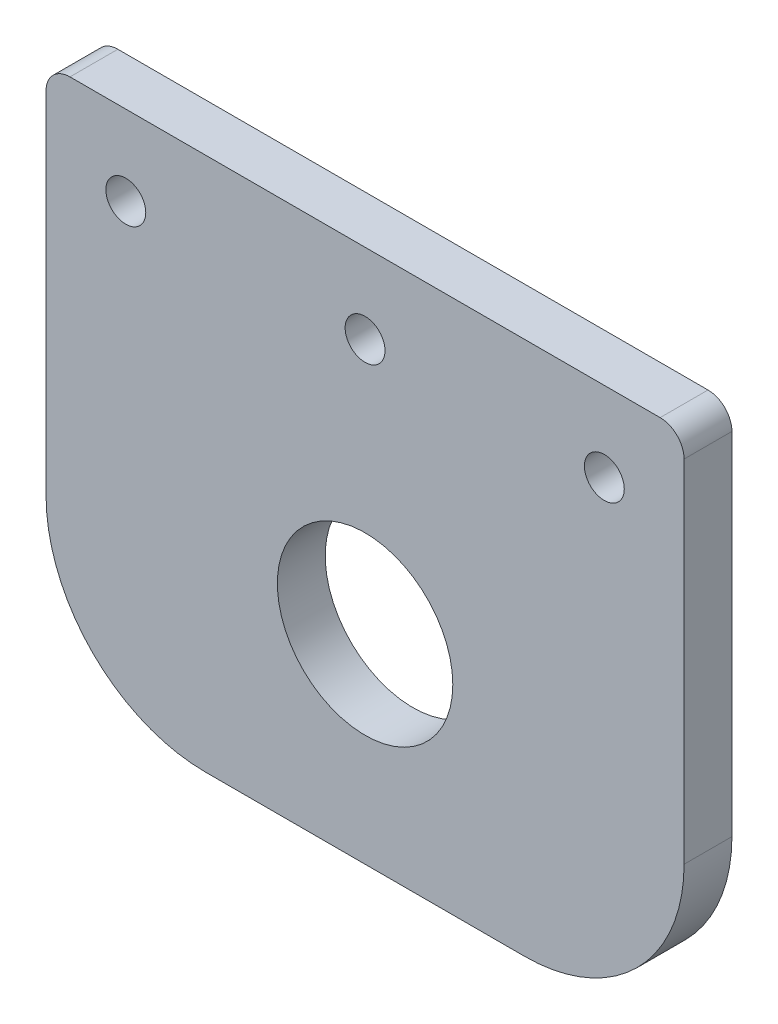
ISO-10303-21;
HEADER;
FILE_DESCRIPTION(('STEP AP214'),'2;1');
FILE_NAME('part.step','',(''),(''),'','','');
FILE_SCHEMA(('AUTOMOTIVE_DESIGN { 1 0 10303 214 1 1 1 1 }'));
ENDSEC;
DATA;
#1=APPLICATION_CONTEXT('core data for automotive mechanical design processes');
#2=APPLICATION_PROTOCOL_DEFINITION('international standard','automotive_design',2000,#1);
#3=PRODUCT_CONTEXT('',#1,'mechanical');
#4=PRODUCT('Part','Part','',(#3));
#5=PRODUCT_RELATED_PRODUCT_CATEGORY('part','',(#4));
#6=PRODUCT_DEFINITION_FORMATION('','',#4);
#7=PRODUCT_DEFINITION_CONTEXT('part definition',#1,'design');
#8=PRODUCT_DEFINITION('design','',#6,#7);
#9=PRODUCT_DEFINITION_SHAPE('','',#8);
#10=(LENGTH_UNIT() NAMED_UNIT(*) SI_UNIT(.MILLI.,.METRE.));
#11=(NAMED_UNIT(*) PLANE_ANGLE_UNIT() SI_UNIT($,.RADIAN.));
#12=(NAMED_UNIT(*) SI_UNIT($,.STERADIAN.) SOLID_ANGLE_UNIT());
#13=UNCERTAINTY_MEASURE_WITH_UNIT(LENGTH_MEASURE(1.E-05),#10,'distance_accuracy_value','');
#14=(GEOMETRIC_REPRESENTATION_CONTEXT(3) GLOBAL_UNCERTAINTY_ASSIGNED_CONTEXT((#13)) GLOBAL_UNIT_ASSIGNED_CONTEXT((#10,
#11,#12)) REPRESENTATION_CONTEXT('',''));
#15=CARTESIAN_POINT('',(0.,0.,0.));
#16=DIRECTION('',(0.,0.,1.));
#17=DIRECTION('',(1.,0.,0.));
#18=AXIS2_PLACEMENT_3D('',#15,#16,#17);
#19=CARTESIAN_POINT('',(0.,0.,6.));
#20=DIRECTION('',(0.,0.,1.));
#21=DIRECTION('',(1.,0.,0.));
#22=AXIS2_PLACEMENT_3D('',#19,#20,#21);
#23=PLANE('',#22);
#24=CARTESIAN_POINT('',(-30.,23.5,6.));
#25=DIRECTION('',(0.,0.,1.));
#26=DIRECTION('',(1.,0.,0.));
#27=AXIS2_PLACEMENT_3D('',#24,#25,#26);
#28=CIRCLE('',#27,2.5);
#29=CARTESIAN_POINT('',(-27.5,23.5,6.));
#30=VERTEX_POINT('',#29);
#31=EDGE_CURVE('E222',#30,#30,#28,.T.);
#32=ORIENTED_EDGE('',*,*,#31,.F.);
#33=EDGE_LOOP('',(#32));
#34=FACE_BOUND('',#33,.T.);
#35=CARTESIAN_POINT('',(0.,23.5,6.));
#36=DIRECTION('',(0.,0.,1.));
#37=DIRECTION('',(1.,0.,0.));
#38=AXIS2_PLACEMENT_3D('',#35,#36,#37);
#39=CIRCLE('',#38,2.5);
#40=CARTESIAN_POINT('',(2.5,23.5,6.));
#41=VERTEX_POINT('',#40);
#42=EDGE_CURVE('E226',#41,#41,#39,.T.);
#43=ORIENTED_EDGE('',*,*,#42,.F.);
#44=EDGE_LOOP('',(#43));
#45=FACE_BOUND('',#44,.T.);
#46=CARTESIAN_POINT('',(30.,23.5,6.));
#47=DIRECTION('',(0.,0.,1.));
#48=DIRECTION('',(1.,0.,0.));
#49=AXIS2_PLACEMENT_3D('',#46,#47,#48);
#50=CIRCLE('',#49,2.5);
#51=CARTESIAN_POINT('',(32.5,23.5,6.));
#52=VERTEX_POINT('',#51);
#53=EDGE_CURVE('E213',#52,#52,#50,.T.);
#54=ORIENTED_EDGE('',*,*,#53,.F.);
#55=EDGE_LOOP('',(#54));
#56=FACE_BOUND('',#55,.T.);
#57=DIRECTION('',(-1.,0.,0.));
#58=VECTOR('',#57,1.);
#59=CARTESIAN_POINT('',(-40.,33.5,6.));
#60=LINE('',#59,#58);
#61=CARTESIAN_POINT('',(37.,33.5,6.));
#62=VERTEX_POINT('',#61);
#63=CARTESIAN_POINT('',(-37.,33.5,6.));
#64=VERTEX_POINT('',#63);
#65=EDGE_CURVE('E192',#62,#64,#60,.T.);
#66=ORIENTED_EDGE('',*,*,#65,.T.);
#67=CARTESIAN_POINT('',(-37.,30.5,6.));
#68=DIRECTION('',(0.,0.,1.));
#69=DIRECTION('',(1.,0.,0.));
#70=AXIS2_PLACEMENT_3D('',#67,#68,#69);
#71=CIRCLE('',#70,3.);
#72=CARTESIAN_POINT('',(-40.,30.5,6.));
#73=VERTEX_POINT('',#72);
#74=EDGE_CURVE('E48',#64,#73,#71,.T.);
#75=ORIENTED_EDGE('',*,*,#74,.T.);
#76=DIRECTION('',(0.,-1.,0.));
#77=VECTOR('',#76,1.);
#78=CARTESIAN_POINT('',(-40.,33.5,6.));
#79=LINE('',#78,#77);
#80=CARTESIAN_POINT('',(-40.,-13.5,6.));
#81=VERTEX_POINT('',#80);
#82=EDGE_CURVE('E191',#73,#81,#79,.T.);
#83=ORIENTED_EDGE('',*,*,#82,.T.);
#84=CARTESIAN_POINT('',(-20.,-13.5,6.));
#85=DIRECTION('',(0.,0.,1.));
#86=DIRECTION('',(1.,0.,0.));
#87=AXIS2_PLACEMENT_3D('',#84,#85,#86);
#88=CIRCLE('',#87,20.);
#89=CARTESIAN_POINT('',(-20.,-33.5,6.));
#90=VERTEX_POINT('',#89);
#91=EDGE_CURVE('E159',#81,#90,#88,.T.);
#92=ORIENTED_EDGE('',*,*,#91,.T.);
#93=DIRECTION('',(1.,0.,0.));
#94=VECTOR('',#93,1.);
#95=CARTESIAN_POINT('',(-40.,-33.5,6.));
#96=LINE('',#95,#94);
#97=CARTESIAN_POINT('',(20.,-33.5,6.));
#98=VERTEX_POINT('',#97);
#99=EDGE_CURVE('E125',#90,#98,#96,.T.);
#100=ORIENTED_EDGE('',*,*,#99,.T.);
#101=CARTESIAN_POINT('',(20.,-13.5,6.));
#102=DIRECTION('',(0.,0.,1.));
#103=DIRECTION('',(1.,0.,0.));
#104=AXIS2_PLACEMENT_3D('',#101,#102,#103);
#105=CIRCLE('',#104,20.);
#106=CARTESIAN_POINT('',(40.,-13.5,6.));
#107=VERTEX_POINT('',#106);
#108=EDGE_CURVE('E162',#98,#107,#105,.T.);
#109=ORIENTED_EDGE('',*,*,#108,.T.);
#110=DIRECTION('',(0.,1.,0.));
#111=VECTOR('',#110,1.);
#112=CARTESIAN_POINT('',(40.,33.5,6.));
#113=LINE('',#112,#111);
#114=CARTESIAN_POINT('',(40.,30.5,6.));
#115=VERTEX_POINT('',#114);
#116=EDGE_CURVE('E123',#107,#115,#113,.T.);
#117=ORIENTED_EDGE('',*,*,#116,.T.);
#118=CARTESIAN_POINT('',(37.,30.5,6.));
#119=DIRECTION('',(0.,0.,1.));
#120=DIRECTION('',(1.,0.,0.));
#121=AXIS2_PLACEMENT_3D('',#118,#119,#120);
#122=CIRCLE('',#121,3.);
#123=EDGE_CURVE('E184',#115,#62,#122,.T.);
#124=ORIENTED_EDGE('',*,*,#123,.T.);
#125=EDGE_LOOP('',(#66,#75,#83,#92,#100,#109,#117,#124));
#126=FACE_BOUND('',#125,.T.);
#127=CARTESIAN_POINT('',(0.,-8.50000000000001,6.));
#128=DIRECTION('',(0.,0.,1.));
#129=DIRECTION('',(1.,0.,0.));
#130=AXIS2_PLACEMENT_3D('',#127,#128,#129);
#131=CIRCLE('',#130,11.);
#132=CARTESIAN_POINT('',(11.,-8.50000000000001,6.));
#133=VERTEX_POINT('',#132);
#134=EDGE_CURVE('E134',#133,#133,#131,.T.);
#135=ORIENTED_EDGE('',*,*,#134,.F.);
#136=EDGE_LOOP('',(#135));
#137=FACE_BOUND('',#136,.T.);
#138=ADVANCED_FACE('F39',(#34,#45,#56,#126,#137),#23,.T.);
#139=CARTESIAN_POINT('',(0.,0.,0.));
#140=DIRECTION('',(0.,0.,1.));
#141=DIRECTION('',(1.,0.,0.));
#142=AXIS2_PLACEMENT_3D('',#139,#140,#141);
#143=PLANE('',#142);
#144=CARTESIAN_POINT('',(-30.,23.5,0.));
#145=DIRECTION('',(0.,0.,-1.));
#146=DIRECTION('',(-1.,0.,0.));
#147=AXIS2_PLACEMENT_3D('',#144,#145,#146);
#148=CIRCLE('',#147,2.5);
#149=CARTESIAN_POINT('',(-32.5,23.5,0.));
#150=VERTEX_POINT('',#149);
#151=EDGE_CURVE('E230',#150,#150,#148,.T.);
#152=ORIENTED_EDGE('',*,*,#151,.F.);
#153=EDGE_LOOP('',(#152));
#154=FACE_BOUND('',#153,.T.);
#155=CARTESIAN_POINT('',(0.,23.5,0.));
#156=DIRECTION('',(0.,0.,-1.));
#157=DIRECTION('',(-1.,0.,0.));
#158=AXIS2_PLACEMENT_3D('',#155,#156,#157);
#159=CIRCLE('',#158,2.5);
#160=CARTESIAN_POINT('',(-2.50000000000001,23.5,0.));
#161=VERTEX_POINT('',#160);
#162=EDGE_CURVE('E231',#161,#161,#159,.T.);
#163=ORIENTED_EDGE('',*,*,#162,.F.);
#164=EDGE_LOOP('',(#163));
#165=FACE_BOUND('',#164,.T.);
#166=CARTESIAN_POINT('',(30.,23.5,0.));
#167=DIRECTION('',(0.,0.,-1.));
#168=DIRECTION('',(-1.,0.,0.));
#169=AXIS2_PLACEMENT_3D('',#166,#167,#168);
#170=CIRCLE('',#169,2.5);
#171=CARTESIAN_POINT('',(27.5,23.5,0.));
#172=VERTEX_POINT('',#171);
#173=EDGE_CURVE('E218',#172,#172,#170,.T.);
#174=ORIENTED_EDGE('',*,*,#173,.F.);
#175=EDGE_LOOP('',(#174));
#176=FACE_BOUND('',#175,.T.);
#177=DIRECTION('',(0.,-1.,0.));
#178=VECTOR('',#177,1.);
#179=CARTESIAN_POINT('',(-40.,33.5,0.));
#180=LINE('',#179,#178);
#181=CARTESIAN_POINT('',(-40.,30.5,0.));
#182=VERTEX_POINT('',#181);
#183=CARTESIAN_POINT('',(-40.,-13.5,0.));
#184=VERTEX_POINT('',#183);
#185=EDGE_CURVE('E138',#182,#184,#180,.T.);
#186=ORIENTED_EDGE('',*,*,#185,.F.);
#187=CARTESIAN_POINT('',(-37.,30.5,0.));
#188=DIRECTION('',(0.,0.,1.));
#189=DIRECTION('',(1.,0.,0.));
#190=AXIS2_PLACEMENT_3D('',#187,#188,#189);
#191=CIRCLE('',#190,3.);
#192=CARTESIAN_POINT('',(-37.,33.5,0.));
#193=VERTEX_POINT('',#192);
#194=EDGE_CURVE('E175',#182,#193,#191,.F.);
#195=ORIENTED_EDGE('',*,*,#194,.T.);
#196=DIRECTION('',(-1.,0.,0.));
#197=VECTOR('',#196,1.);
#198=CARTESIAN_POINT('',(-40.,33.5,0.));
#199=LINE('',#198,#197);
#200=CARTESIAN_POINT('',(37.,33.5,0.));
#201=VERTEX_POINT('',#200);
#202=EDGE_CURVE('E133',#201,#193,#199,.T.);
#203=ORIENTED_EDGE('',*,*,#202,.F.);
#204=CARTESIAN_POINT('',(37.,30.5,0.));
#205=DIRECTION('',(0.,0.,1.));
#206=DIRECTION('',(1.,0.,0.));
#207=AXIS2_PLACEMENT_3D('',#204,#205,#206);
#208=CIRCLE('',#207,3.);
#209=CARTESIAN_POINT('',(40.,30.5,0.));
#210=VERTEX_POINT('',#209);
#211=EDGE_CURVE('E131',#201,#210,#208,.F.);
#212=ORIENTED_EDGE('',*,*,#211,.T.);
#213=DIRECTION('',(0.,1.,0.));
#214=VECTOR('',#213,1.);
#215=CARTESIAN_POINT('',(40.,33.5,0.));
#216=LINE('',#215,#214);
#217=CARTESIAN_POINT('',(40.,-13.5,0.));
#218=VERTEX_POINT('',#217);
#219=EDGE_CURVE('E122',#218,#210,#216,.T.);
#220=ORIENTED_EDGE('',*,*,#219,.F.);
#221=CARTESIAN_POINT('',(20.,-13.5,0.));
#222=DIRECTION('',(0.,0.,1.));
#223=DIRECTION('',(1.,0.,0.));
#224=AXIS2_PLACEMENT_3D('',#221,#222,#223);
#225=CIRCLE('',#224,20.);
#226=CARTESIAN_POINT('',(20.,-33.5,0.));
#227=VERTEX_POINT('',#226);
#228=EDGE_CURVE('E107',#218,#227,#225,.F.);
#229=ORIENTED_EDGE('',*,*,#228,.T.);
#230=DIRECTION('',(1.,0.,0.));
#231=VECTOR('',#230,1.);
#232=CARTESIAN_POINT('',(-40.,-33.5,0.));
#233=LINE('',#232,#231);
#234=CARTESIAN_POINT('',(-20.,-33.5,0.));
#235=VERTEX_POINT('',#234);
#236=EDGE_CURVE('E148',#235,#227,#233,.T.);
#237=ORIENTED_EDGE('',*,*,#236,.F.);
#238=CARTESIAN_POINT('',(-20.,-13.5,0.));
#239=DIRECTION('',(0.,0.,1.));
#240=DIRECTION('',(1.,0.,0.));
#241=AXIS2_PLACEMENT_3D('',#238,#239,#240);
#242=CIRCLE('',#241,20.);
#243=EDGE_CURVE('E119',#235,#184,#242,.F.);
#244=ORIENTED_EDGE('',*,*,#243,.T.);
#245=EDGE_LOOP('',(#186,#195,#203,#212,#220,#229,#237,#244));
#246=FACE_BOUND('',#245,.T.);
#247=CARTESIAN_POINT('',(0.,-8.50000000000001,0.));
#248=DIRECTION('',(0.,0.,1.));
#249=DIRECTION('',(1.,0.,0.));
#250=AXIS2_PLACEMENT_3D('',#247,#248,#249);
#251=CIRCLE('',#250,11.);
#252=CARTESIAN_POINT('',(11.,-8.50000000000001,0.));
#253=VERTEX_POINT('',#252);
#254=EDGE_CURVE('E141',#253,#253,#251,.T.);
#255=ORIENTED_EDGE('',*,*,#254,.T.);
#256=EDGE_LOOP('',(#255));
#257=FACE_BOUND('',#256,.T.);
#258=ADVANCED_FACE('F128',(#154,#165,#176,#246,#257),#143,.F.);
#259=CARTESIAN_POINT('',(40.,33.5,6.));
#260=DIRECTION('',(-1.,0.,0.));
#261=DIRECTION('',(0.,-1.,0.));
#262=AXIS2_PLACEMENT_3D('',#259,#260,#261);
#263=PLANE('',#262);
#264=ORIENTED_EDGE('',*,*,#219,.T.);
#265=DIRECTION('',(0.,0.,-1.));
#266=VECTOR('',#265,1.);
#267=CARTESIAN_POINT('',(40.,30.5,6.));
#268=LINE('',#267,#266);
#269=EDGE_CURVE('E11',#210,#115,#268,.F.);
#270=ORIENTED_EDGE('',*,*,#269,.T.);
#271=ORIENTED_EDGE('',*,*,#116,.F.);
#272=DIRECTION('',(0.,0.,-1.));
#273=VECTOR('',#272,1.);
#274=CARTESIAN_POINT('',(40.,-13.5,6.));
#275=LINE('',#274,#273);
#276=EDGE_CURVE('E111',#107,#218,#275,.T.);
#277=ORIENTED_EDGE('',*,*,#276,.T.);
#278=EDGE_LOOP('',(#264,#270,#271,#277));
#279=FACE_BOUND('',#278,.T.);
#280=ADVANCED_FACE('F121',(#279),#263,.F.);
#281=CARTESIAN_POINT('',(-40.,33.5,6.));
#282=DIRECTION('',(0.,-1.,0.));
#283=DIRECTION('',(0.,0.,-1.));
#284=AXIS2_PLACEMENT_3D('',#281,#282,#283);
#285=PLANE('',#284);
#286=ORIENTED_EDGE('',*,*,#202,.T.);
#287=DIRECTION('',(0.,0.,-1.));
#288=VECTOR('',#287,1.);
#289=CARTESIAN_POINT('',(-37.,33.5,6.));
#290=LINE('',#289,#288);
#291=EDGE_CURVE('E61',#193,#64,#290,.F.);
#292=ORIENTED_EDGE('',*,*,#291,.T.);
#293=ORIENTED_EDGE('',*,*,#65,.F.);
#294=DIRECTION('',(0.,0.,-1.));
#295=VECTOR('',#294,1.);
#296=CARTESIAN_POINT('',(37.,33.5,6.));
#297=LINE('',#296,#295);
#298=EDGE_CURVE('E178',#62,#201,#297,.T.);
#299=ORIENTED_EDGE('',*,*,#298,.T.);
#300=EDGE_LOOP('',(#286,#292,#293,#299));
#301=FACE_BOUND('',#300,.T.);
#302=ADVANCED_FACE('F201',(#301),#285,.F.);
#303=CARTESIAN_POINT('',(-40.,33.5,6.));
#304=DIRECTION('',(1.,0.,0.));
#305=DIRECTION('',(0.,1.,0.));
#306=AXIS2_PLACEMENT_3D('',#303,#304,#305);
#307=PLANE('',#306);
#308=ORIENTED_EDGE('',*,*,#82,.F.);
#309=DIRECTION('',(0.,0.,-1.));
#310=VECTOR('',#309,1.);
#311=CARTESIAN_POINT('',(-40.,30.5,6.));
#312=LINE('',#311,#310);
#313=EDGE_CURVE('E169',#73,#182,#312,.T.);
#314=ORIENTED_EDGE('',*,*,#313,.T.);
#315=ORIENTED_EDGE('',*,*,#185,.T.);
#316=DIRECTION('',(0.,0.,-1.));
#317=VECTOR('',#316,1.);
#318=CARTESIAN_POINT('',(-40.,-13.5,6.));
#319=LINE('',#318,#317);
#320=EDGE_CURVE('E165',#184,#81,#319,.F.);
#321=ORIENTED_EDGE('',*,*,#320,.T.);
#322=EDGE_LOOP('',(#308,#314,#315,#321));
#323=FACE_BOUND('',#322,.T.);
#324=ADVANCED_FACE('F196',(#323),#307,.F.);
#325=CARTESIAN_POINT('',(-40.,-33.5,6.));
#326=DIRECTION('',(0.,1.,0.));
#327=DIRECTION('',(0.,0.,1.));
#328=AXIS2_PLACEMENT_3D('',#325,#326,#327);
#329=PLANE('',#328);
#330=ORIENTED_EDGE('',*,*,#236,.T.);
#331=DIRECTION('',(0.,0.,-1.));
#332=VECTOR('',#331,1.);
#333=CARTESIAN_POINT('',(20.,-33.5,6.));
#334=LINE('',#333,#332);
#335=EDGE_CURVE('E112',#227,#98,#334,.F.);
#336=ORIENTED_EDGE('',*,*,#335,.T.);
#337=ORIENTED_EDGE('',*,*,#99,.F.);
#338=DIRECTION('',(0.,0.,-1.));
#339=VECTOR('',#338,1.);
#340=CARTESIAN_POINT('',(-20.,-33.5,6.));
#341=LINE('',#340,#339);
#342=EDGE_CURVE('E118',#90,#235,#341,.T.);
#343=ORIENTED_EDGE('',*,*,#342,.T.);
#344=EDGE_LOOP('',(#330,#336,#337,#343));
#345=FACE_BOUND('',#344,.T.);
#346=ADVANCED_FACE('F260',(#345),#329,.F.);
#347=CARTESIAN_POINT('',(0.,-8.50000000000001,6.));
#348=DIRECTION('',(0.,0.,-1.));
#349=DIRECTION('',(-1.,0.,0.));
#350=AXIS2_PLACEMENT_3D('',#347,#348,#349);
#351=CYLINDRICAL_SURFACE('',#350,11.);
#352=ORIENTED_EDGE('',*,*,#134,.T.);
#353=EDGE_LOOP('',(#352));
#354=FACE_BOUND('',#353,.T.);
#355=ORIENTED_EDGE('',*,*,#254,.F.);
#356=EDGE_LOOP('',(#355));
#357=FACE_BOUND('',#356,.T.);
#358=ADVANCED_FACE('F251',(#354,#357),#351,.F.);
#359=CARTESIAN_POINT('',(30.,23.5,10.));
#360=DIRECTION('',(0.,0.,-1.));
#361=DIRECTION('',(-1.,0.,0.));
#362=AXIS2_PLACEMENT_3D('',#359,#360,#361);
#363=CYLINDRICAL_SURFACE('',#362,2.5);
#364=ORIENTED_EDGE('',*,*,#53,.T.);
#365=EDGE_LOOP('',(#364));
#366=FACE_BOUND('',#365,.T.);
#367=ORIENTED_EDGE('',*,*,#173,.T.);
#368=EDGE_LOOP('',(#367));
#369=FACE_BOUND('',#368,.T.);
#370=ADVANCED_FACE('F248',(#366,#369),#363,.F.);
#371=CARTESIAN_POINT('',(0.,23.5,10.));
#372=DIRECTION('',(0.,0.,-1.));
#373=DIRECTION('',(-1.,0.,0.));
#374=AXIS2_PLACEMENT_3D('',#371,#372,#373);
#375=CYLINDRICAL_SURFACE('',#374,2.5);
#376=ORIENTED_EDGE('',*,*,#42,.T.);
#377=EDGE_LOOP('',(#376));
#378=FACE_BOUND('',#377,.T.);
#379=ORIENTED_EDGE('',*,*,#162,.T.);
#380=EDGE_LOOP('',(#379));
#381=FACE_BOUND('',#380,.T.);
#382=ADVANCED_FACE('F250',(#378,#381),#375,.F.);
#383=CARTESIAN_POINT('',(-30.,23.5,10.));
#384=DIRECTION('',(0.,0.,-1.));
#385=DIRECTION('',(-1.,0.,0.));
#386=AXIS2_PLACEMENT_3D('',#383,#384,#385);
#387=CYLINDRICAL_SURFACE('',#386,2.5);
#388=ORIENTED_EDGE('',*,*,#31,.T.);
#389=EDGE_LOOP('',(#388));
#390=FACE_BOUND('',#389,.T.);
#391=ORIENTED_EDGE('',*,*,#151,.T.);
#392=EDGE_LOOP('',(#391));
#393=FACE_BOUND('',#392,.T.);
#394=ADVANCED_FACE('F239',(#390,#393),#387,.F.);
#395=CARTESIAN_POINT('',(20.,-13.5,6.));
#396=DIRECTION('',(0.,0.,-1.));
#397=DIRECTION('',(-1.,0.,0.));
#398=AXIS2_PLACEMENT_3D('',#395,#396,#397);
#399=CYLINDRICAL_SURFACE('',#398,20.);
#400=ORIENTED_EDGE('',*,*,#108,.F.);
#401=ORIENTED_EDGE('',*,*,#335,.F.);
#402=ORIENTED_EDGE('',*,*,#228,.F.);
#403=ORIENTED_EDGE('',*,*,#276,.F.);
#404=EDGE_LOOP('',(#400,#401,#402,#403));
#405=FACE_BOUND('',#404,.T.);
#406=ADVANCED_FACE('F110',(#405),#399,.T.);
#407=CARTESIAN_POINT('',(-20.,-13.5,6.));
#408=DIRECTION('',(0.,0.,-1.));
#409=DIRECTION('',(-1.,0.,0.));
#410=AXIS2_PLACEMENT_3D('',#407,#408,#409);
#411=CYLINDRICAL_SURFACE('',#410,20.);
#412=ORIENTED_EDGE('',*,*,#91,.F.);
#413=ORIENTED_EDGE('',*,*,#320,.F.);
#414=ORIENTED_EDGE('',*,*,#243,.F.);
#415=ORIENTED_EDGE('',*,*,#342,.F.);
#416=EDGE_LOOP('',(#412,#413,#414,#415));
#417=FACE_BOUND('',#416,.T.);
#418=ADVANCED_FACE('F282',(#417),#411,.T.);
#419=CARTESIAN_POINT('',(-37.,30.5,6.));
#420=DIRECTION('',(0.,0.,-1.));
#421=DIRECTION('',(-1.,0.,0.));
#422=AXIS2_PLACEMENT_3D('',#419,#420,#421);
#423=CYLINDRICAL_SURFACE('',#422,3.);
#424=ORIENTED_EDGE('',*,*,#74,.F.);
#425=ORIENTED_EDGE('',*,*,#291,.F.);
#426=ORIENTED_EDGE('',*,*,#194,.F.);
#427=ORIENTED_EDGE('',*,*,#313,.F.);
#428=EDGE_LOOP('',(#424,#425,#426,#427));
#429=FACE_BOUND('',#428,.T.);
#430=ADVANCED_FACE('F200',(#429),#423,.T.);
#431=CARTESIAN_POINT('',(37.,30.5,6.));
#432=DIRECTION('',(0.,0.,-1.));
#433=DIRECTION('',(-1.,0.,0.));
#434=AXIS2_PLACEMENT_3D('',#431,#432,#433);
#435=CYLINDRICAL_SURFACE('',#434,3.);
#436=ORIENTED_EDGE('',*,*,#123,.F.);
#437=ORIENTED_EDGE('',*,*,#269,.F.);
#438=ORIENTED_EDGE('',*,*,#211,.F.);
#439=ORIENTED_EDGE('',*,*,#298,.F.);
#440=EDGE_LOOP('',(#436,#437,#438,#439));
#441=FACE_BOUND('',#440,.T.);
#442=ADVANCED_FACE('F41',(#441),#435,.T.);
#443=CLOSED_SHELL('',(#138,#258,#280,#302,#324,#346,#358,#370,#382,#394,#406,#418,#430,#442));
#444=MANIFOLD_SOLID_BREP('B2',#443);
#445=ADVANCED_BREP_SHAPE_REPRESENTATION('',(#18,#444),#14);
#446=SHAPE_DEFINITION_REPRESENTATION(#9,#445);
ENDSEC;
END-ISO-10303-21;
